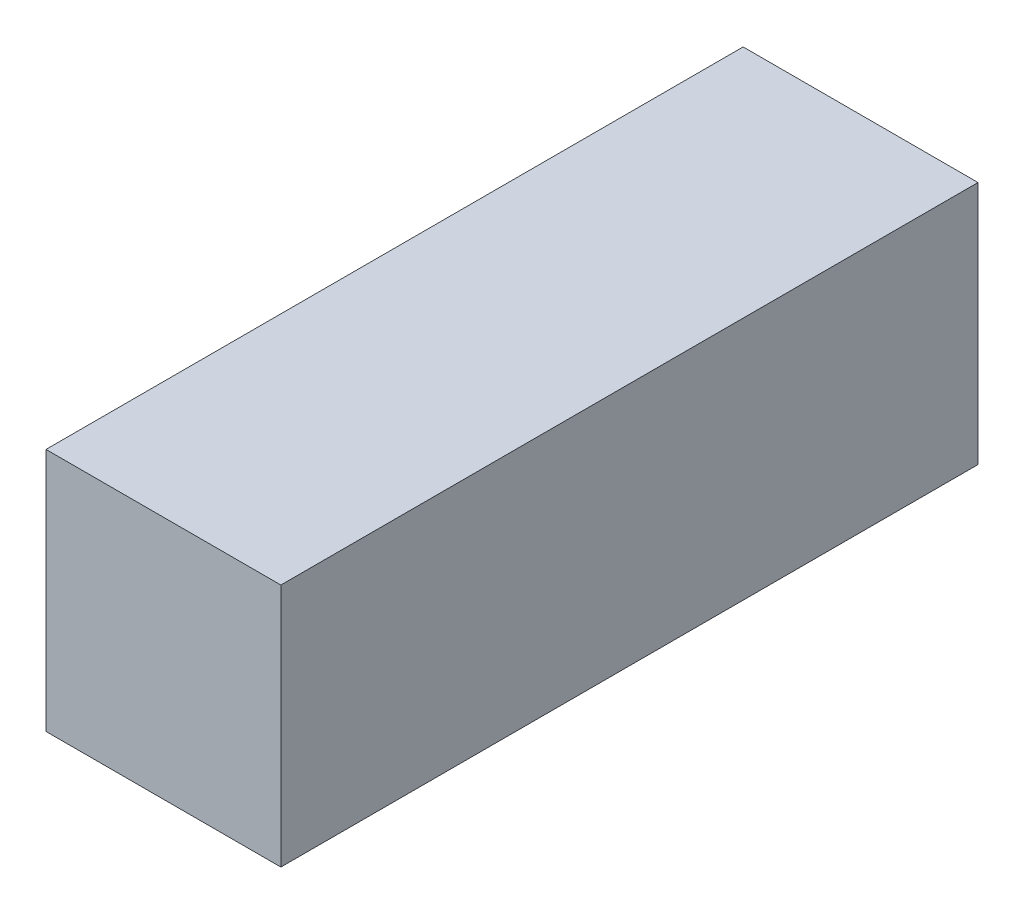
ISO-10303-21;
HEADER;
FILE_DESCRIPTION(('STEP AP214'),'2;1');
FILE_NAME('part.step','',(''),(''),'','','');
FILE_SCHEMA(('AUTOMOTIVE_DESIGN { 1 0 10303 214 1 1 1 1 }'));
ENDSEC;
DATA;
#1=APPLICATION_CONTEXT('core data for automotive mechanical design processes');
#2=APPLICATION_PROTOCOL_DEFINITION('international standard','automotive_design',2000,#1);
#3=PRODUCT_CONTEXT('',#1,'mechanical');
#4=PRODUCT('Part','Part','',(#3));
#5=PRODUCT_RELATED_PRODUCT_CATEGORY('part','',(#4));
#6=PRODUCT_DEFINITION_FORMATION('','',#4);
#7=PRODUCT_DEFINITION_CONTEXT('part definition',#1,'design');
#8=PRODUCT_DEFINITION('design','',#6,#7);
#9=PRODUCT_DEFINITION_SHAPE('','',#8);
#10=(LENGTH_UNIT() NAMED_UNIT(*) SI_UNIT(.MILLI.,.METRE.));
#11=(NAMED_UNIT(*) PLANE_ANGLE_UNIT() SI_UNIT($,.RADIAN.));
#12=(NAMED_UNIT(*) SI_UNIT($,.STERADIAN.) SOLID_ANGLE_UNIT());
#13=UNCERTAINTY_MEASURE_WITH_UNIT(LENGTH_MEASURE(1.E-05),#10,'distance_accuracy_value','');
#14=(GEOMETRIC_REPRESENTATION_CONTEXT(3) GLOBAL_UNCERTAINTY_ASSIGNED_CONTEXT((#13)) GLOBAL_UNIT_ASSIGNED_CONTEXT((#10,
#11,#12)) REPRESENTATION_CONTEXT('',''));
#15=CARTESIAN_POINT('',(0.,0.,0.));
#16=DIRECTION('',(0.,0.,1.));
#17=DIRECTION('',(1.,0.,0.));
#18=AXIS2_PLACEMENT_3D('',#15,#16,#17);
#19=CARTESIAN_POINT('',(-513.412488714447,-534.031111792996,-1588.));
#20=DIRECTION('',(1.,0.,0.));
#21=DIRECTION('',(0.,0.,-1.));
#22=AXIS2_PLACEMENT_3D('',#19,#20,#21);
#23=PLANE('',#22);
#24=DIRECTION('',(0.,1.,0.));
#25=VECTOR('',#24,1.);
#26=CARTESIAN_POINT('',(-513.412488714447,-534.031111792996,1460.));
#27=LINE('',#26,#25);
#28=CARTESIAN_POINT('',(-513.412488714447,-534.031111792996,1460.));
#29=VERTEX_POINT('',#28);
#30=CARTESIAN_POINT('',(-513.412488714447,534.031111792996,1460.));
#31=VERTEX_POINT('',#30);
#32=EDGE_CURVE('E107',#29,#31,#27,.T.);
#33=ORIENTED_EDGE('',*,*,#32,.T.);
#34=DIRECTION('',(0.,0.,1.));
#35=VECTOR('',#34,1.);
#36=CARTESIAN_POINT('',(-513.412488714447,534.031111792996,-1588.));
#37=LINE('',#36,#35);
#38=CARTESIAN_POINT('',(-513.412488714447,534.031111792996,-1588.));
#39=VERTEX_POINT('',#38);
#40=EDGE_CURVE('E11',#39,#31,#37,.T.);
#41=ORIENTED_EDGE('',*,*,#40,.F.);
#42=DIRECTION('',(0.,1.,0.));
#43=VECTOR('',#42,1.);
#44=CARTESIAN_POINT('',(-513.412488714447,-534.031111792996,-1588.));
#45=LINE('',#44,#43);
#46=CARTESIAN_POINT('',(-513.412488714447,-534.031111792996,-1588.));
#47=VERTEX_POINT('',#46);
#48=EDGE_CURVE('E121',#47,#39,#45,.T.);
#49=ORIENTED_EDGE('',*,*,#48,.F.);
#50=DIRECTION('',(0.,0.,1.));
#51=VECTOR('',#50,1.);
#52=CARTESIAN_POINT('',(-513.412488714447,-534.031111792996,-1588.));
#53=LINE('',#52,#51);
#54=EDGE_CURVE('E62',#47,#29,#53,.T.);
#55=ORIENTED_EDGE('',*,*,#54,.T.);
#56=EDGE_LOOP('',(#33,#41,#49,#55));
#57=FACE_BOUND('',#56,.T.);
#58=ADVANCED_FACE('F45',(#57),#23,.F.);
#59=CARTESIAN_POINT('',(-513.412488714447,534.031111792996,-1588.));
#60=DIRECTION('',(0.,-1.,0.));
#61=DIRECTION('',(0.,0.,-1.));
#62=AXIS2_PLACEMENT_3D('',#59,#60,#61);
#63=PLANE('',#62);
#64=DIRECTION('',(1.,0.,0.));
#65=VECTOR('',#64,1.);
#66=CARTESIAN_POINT('',(-513.412488714447,534.031111792996,1460.));
#67=LINE('',#66,#65);
#68=CARTESIAN_POINT('',(513.412488714447,534.031111792996,1460.));
#69=VERTEX_POINT('',#68);
#70=EDGE_CURVE('E113',#31,#69,#67,.T.);
#71=ORIENTED_EDGE('',*,*,#70,.T.);
#72=DIRECTION('',(0.,0.,1.));
#73=VECTOR('',#72,1.);
#74=CARTESIAN_POINT('',(513.412488714447,534.031111792996,-1588.));
#75=LINE('',#74,#73);
#76=CARTESIAN_POINT('',(513.412488714447,534.031111792996,-1588.));
#77=VERTEX_POINT('',#76);
#78=EDGE_CURVE('E54',#77,#69,#75,.T.);
#79=ORIENTED_EDGE('',*,*,#78,.F.);
#80=DIRECTION('',(1.,0.,0.));
#81=VECTOR('',#80,1.);
#82=CARTESIAN_POINT('',(-513.412488714447,534.031111792996,-1588.));
#83=LINE('',#82,#81);
#84=EDGE_CURVE('E88',#39,#77,#83,.T.);
#85=ORIENTED_EDGE('',*,*,#84,.F.);
#86=ORIENTED_EDGE('',*,*,#40,.T.);
#87=EDGE_LOOP('',(#71,#79,#85,#86));
#88=FACE_BOUND('',#87,.T.);
#89=ADVANCED_FACE('F150',(#88),#63,.F.);
#90=CARTESIAN_POINT('',(513.412488714447,-534.031111792996,-1588.));
#91=DIRECTION('',(1.,0.,0.));
#92=DIRECTION('',(0.,0.,-1.));
#93=AXIS2_PLACEMENT_3D('',#90,#91,#92);
#94=PLANE('',#93);
#95=DIRECTION('',(0.,1.,0.));
#96=VECTOR('',#95,1.);
#97=CARTESIAN_POINT('',(513.412488714447,-534.031111792996,1460.));
#98=LINE('',#97,#96);
#99=CARTESIAN_POINT('',(513.412488714447,-534.031111792996,1460.));
#100=VERTEX_POINT('',#99);
#101=EDGE_CURVE('E136',#100,#69,#98,.T.);
#102=ORIENTED_EDGE('',*,*,#101,.F.);
#103=DIRECTION('',(0.,0.,1.));
#104=VECTOR('',#103,1.);
#105=CARTESIAN_POINT('',(513.412488714447,-534.031111792996,-1588.));
#106=LINE('',#105,#104);
#107=CARTESIAN_POINT('',(513.412488714447,-534.031111792996,-1588.));
#108=VERTEX_POINT('',#107);
#109=EDGE_CURVE('E77',#108,#100,#106,.T.);
#110=ORIENTED_EDGE('',*,*,#109,.F.);
#111=DIRECTION('',(0.,1.,0.));
#112=VECTOR('',#111,1.);
#113=CARTESIAN_POINT('',(513.412488714447,-534.031111792996,-1588.));
#114=LINE('',#113,#112);
#115=EDGE_CURVE('E127',#108,#77,#114,.T.);
#116=ORIENTED_EDGE('',*,*,#115,.T.);
#117=ORIENTED_EDGE('',*,*,#78,.T.);
#118=EDGE_LOOP('',(#102,#110,#116,#117));
#119=FACE_BOUND('',#118,.T.);
#120=ADVANCED_FACE('F148',(#119),#94,.T.);
#121=CARTESIAN_POINT('',(-513.412488714447,-534.031111792996,-1588.));
#122=DIRECTION('',(0.,-1.,0.));
#123=DIRECTION('',(0.,0.,-1.));
#124=AXIS2_PLACEMENT_3D('',#121,#122,#123);
#125=PLANE('',#124);
#126=DIRECTION('',(1.,0.,0.));
#127=VECTOR('',#126,1.);
#128=CARTESIAN_POINT('',(-513.412488714447,-534.031111792996,1460.));
#129=LINE('',#128,#127);
#130=EDGE_CURVE('E124',#29,#100,#129,.T.);
#131=ORIENTED_EDGE('',*,*,#130,.F.);
#132=ORIENTED_EDGE('',*,*,#54,.F.);
#133=DIRECTION('',(1.,0.,0.));
#134=VECTOR('',#133,1.);
#135=CARTESIAN_POINT('',(-513.412488714447,-534.031111792996,-1588.));
#136=LINE('',#135,#134);
#137=EDGE_CURVE('E131',#47,#108,#136,.T.);
#138=ORIENTED_EDGE('',*,*,#137,.T.);
#139=ORIENTED_EDGE('',*,*,#109,.T.);
#140=EDGE_LOOP('',(#131,#132,#138,#139));
#141=FACE_BOUND('',#140,.T.);
#142=ADVANCED_FACE('F154',(#141),#125,.T.);
#143=CARTESIAN_POINT('',(0.,0.,-1588.));
#144=DIRECTION('',(0.,0.,-1.));
#145=DIRECTION('',(-1.,0.,0.));
#146=AXIS2_PLACEMENT_3D('',#143,#144,#145);
#147=PLANE('',#146);
#148=ORIENTED_EDGE('',*,*,#48,.T.);
#149=ORIENTED_EDGE('',*,*,#84,.T.);
#150=ORIENTED_EDGE('',*,*,#115,.F.);
#151=ORIENTED_EDGE('',*,*,#137,.F.);
#152=EDGE_LOOP('',(#148,#149,#150,#151));
#153=FACE_BOUND('',#152,.T.);
#154=ADVANCED_FACE('F156',(#153),#147,.T.);
#155=CARTESIAN_POINT('',(0.,0.,1460.));
#156=DIRECTION('',(0.,0.,-1.));
#157=DIRECTION('',(-1.,0.,0.));
#158=AXIS2_PLACEMENT_3D('',#155,#156,#157);
#159=PLANE('',#158);
#160=ORIENTED_EDGE('',*,*,#32,.F.);
#161=ORIENTED_EDGE('',*,*,#130,.T.);
#162=ORIENTED_EDGE('',*,*,#101,.T.);
#163=ORIENTED_EDGE('',*,*,#70,.F.);
#164=EDGE_LOOP('',(#160,#161,#162,#163));
#165=FACE_BOUND('',#164,.T.);
#166=ADVANCED_FACE('F153',(#165),#159,.F.);
#167=CLOSED_SHELL('',(#58,#89,#120,#142,#154,#166));
#168=CARTESIAN_POINT('',(0.,0.,-1371.6));
#169=CARTESIAN_POINT('',(0.,374.058740476197,-754.172424681311));
#170=CARTESIAN_POINT('',(0.,457.2,0.));
#171=B_SPLINE_CURVE_WITH_KNOTS('',2,(#168,#169,#170),.UNSPECIFIED.,.F.,.F.,(3,3),(0.,
0.947101694661219),.UNSPECIFIED.);
#172=CARTESIAN_POINT('',(0.,0.,1371.6));
#173=DIRECTION('',(0.,0.,1.));
#174=AXIS1_PLACEMENT('',#172,#173);
#175=SURFACE_OF_REVOLUTION('',#171,#174);
#176=CARTESIAN_POINT('',(0.,0.,0.));
#177=DIRECTION('',(0.,0.,1.));
#178=DIRECTION('',(1.,0.,0.));
#179=AXIS2_PLACEMENT_3D('',#176,#177,#178);
#180=CIRCLE('',#179,457.2);
#181=CARTESIAN_POINT('',(457.2,0.,0.));
#182=VERTEX_POINT('',#181);
#183=EDGE_CURVE('E104',#182,#182,#180,.T.);
#184=ORIENTED_EDGE('',*,*,#183,.T.);
#185=EDGE_LOOP('',(#184));
#186=FACE_BOUND('',#185,.T.);
#187=CARTESIAN_POINT('',(0.,0.,-1371.6));
#188=VERTEX_POINT('',#187);
#189=VERTEX_LOOP('',#188);
#190=FACE_BOUND('',#189,.T.);
#191=ADVANCED_FACE('F99',(#186,#190),#175,.F.);
#192=CARTESIAN_POINT('',(0.,457.2,0.));
#193=CARTESIAN_POINT('',(0.,487.528566421841,443.029223322684));
#194=CARTESIAN_POINT('',(0.,494.854511367004,1157.28646821721));
#195=CARTESIAN_POINT('',(0.,0.,1371.6));
#196=B_SPLINE_CURVE_WITH_KNOTS('',3,(#192,#193,#194,#195),.UNSPECIFIED.,.F.,.F.,(4,4),(0.,1.),.UNSPECIFIED.);
#197=CARTESIAN_POINT('',(0.,0.,1371.6));
#198=DIRECTION('',(0.,0.,1.));
#199=AXIS1_PLACEMENT('',#197,#198);
#200=SURFACE_OF_REVOLUTION('',#196,#199);
#201=CARTESIAN_POINT('',(0.,0.,1371.6));
#202=VERTEX_POINT('',#201);
#203=VERTEX_LOOP('',#202);
#204=FACE_BOUND('',#203,.T.);
#205=ORIENTED_EDGE('',*,*,#183,.F.);
#206=EDGE_LOOP('',(#205));
#207=FACE_BOUND('',#206,.T.);
#208=ADVANCED_FACE('F96',(#204,#207),#200,.F.);
#209=CLOSED_SHELL('',(#191,#208));
#210=ORIENTED_CLOSED_SHELL('',*,#209,.T.);
#211=BREP_WITH_VOIDS('B2',#167,(#210));
#212=ADVANCED_BREP_SHAPE_REPRESENTATION('',(#18,#211),#14);
#213=SHAPE_DEFINITION_REPRESENTATION(#9,#212);
ENDSEC;
END-ISO-10303-21;
